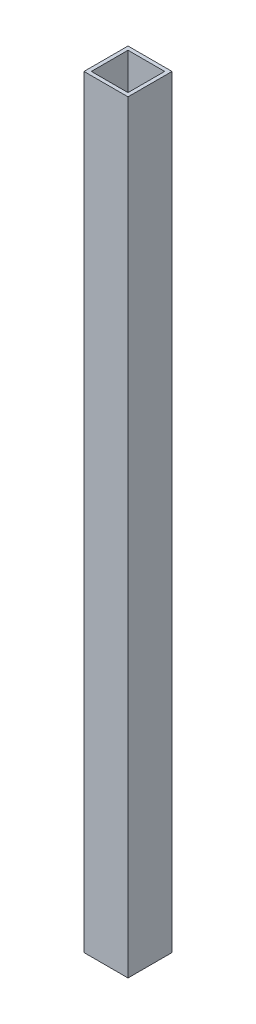
ISO-10303-21;
HEADER;
FILE_DESCRIPTION(('STEP AP214'),'2;1');
FILE_NAME('part.step','',(''),(''),'','','');
FILE_SCHEMA(('AUTOMOTIVE_DESIGN { 1 0 10303 214 1 1 1 1 }'));
ENDSEC;
DATA;
#1=APPLICATION_CONTEXT('core data for automotive mechanical design processes');
#2=APPLICATION_PROTOCOL_DEFINITION('international standard','automotive_design',2000,#1);
#3=PRODUCT_CONTEXT('',#1,'mechanical');
#4=PRODUCT('Part','Part','',(#3));
#5=PRODUCT_RELATED_PRODUCT_CATEGORY('part','',(#4));
#6=PRODUCT_DEFINITION_FORMATION('','',#4);
#7=PRODUCT_DEFINITION_CONTEXT('part definition',#1,'design');
#8=PRODUCT_DEFINITION('design','',#6,#7);
#9=PRODUCT_DEFINITION_SHAPE('','',#8);
#10=(LENGTH_UNIT() NAMED_UNIT(*) SI_UNIT(.MILLI.,.METRE.));
#11=(NAMED_UNIT(*) PLANE_ANGLE_UNIT() SI_UNIT($,.RADIAN.));
#12=(NAMED_UNIT(*) SI_UNIT($,.STERADIAN.) SOLID_ANGLE_UNIT());
#13=UNCERTAINTY_MEASURE_WITH_UNIT(LENGTH_MEASURE(1.E-05),#10,'distance_accuracy_value','');
#14=(GEOMETRIC_REPRESENTATION_CONTEXT(3) GLOBAL_UNCERTAINTY_ASSIGNED_CONTEXT((#13)) GLOBAL_UNIT_ASSIGNED_CONTEXT((#10,
#11,#12)) REPRESENTATION_CONTEXT('',''));
#15=CARTESIAN_POINT('',(0.,0.,0.));
#16=DIRECTION('',(0.,0.,1.));
#17=DIRECTION('',(1.,0.,0.));
#18=AXIS2_PLACEMENT_3D('',#15,#16,#17);
#19=CARTESIAN_POINT('',(0.,330.2,0.));
#20=DIRECTION('',(0.,-1.,0.));
#21=DIRECTION('',(0.,0.,-1.));
#22=AXIS2_PLACEMENT_3D('',#19,#20,#21);
#23=PLANE('',#22);
#24=DIRECTION('',(0.,0.,1.));
#25=VECTOR('',#24,1.);
#26=CARTESIAN_POINT('',(0.,330.2,0.));
#27=LINE('',#26,#25);
#28=CARTESIAN_POINT('',(0.,330.2,-19.05));
#29=VERTEX_POINT('',#28);
#30=CARTESIAN_POINT('',(0.,330.2,0.));
#31=VERTEX_POINT('',#30);
#32=EDGE_CURVE('E134',#29,#31,#27,.T.);
#33=ORIENTED_EDGE('',*,*,#32,.T.);
#34=DIRECTION('',(1.,0.,0.));
#35=VECTOR('',#34,1.);
#36=CARTESIAN_POINT('',(0.,330.2,0.));
#37=LINE('',#36,#35);
#38=CARTESIAN_POINT('',(19.05,330.2,0.));
#39=VERTEX_POINT('',#38);
#40=EDGE_CURVE('E137',#31,#39,#37,.T.);
#41=ORIENTED_EDGE('',*,*,#40,.T.);
#42=DIRECTION('',(0.,0.,-1.));
#43=VECTOR('',#42,1.);
#44=CARTESIAN_POINT('',(19.05,330.2,0.));
#45=LINE('',#44,#43);
#46=CARTESIAN_POINT('',(19.05,330.2,-19.05));
#47=VERTEX_POINT('',#46);
#48=EDGE_CURVE('E140',#39,#47,#45,.T.);
#49=ORIENTED_EDGE('',*,*,#48,.T.);
#50=DIRECTION('',(-1.,0.,0.));
#51=VECTOR('',#50,1.);
#52=CARTESIAN_POINT('',(0.,330.2,-19.05));
#53=LINE('',#52,#51);
#54=EDGE_CURVE('E142',#47,#29,#53,.T.);
#55=ORIENTED_EDGE('',*,*,#54,.T.);
#56=EDGE_LOOP('',(#33,#41,#49,#55));
#57=FACE_BOUND('',#56,.T.);
#58=DIRECTION('',(0.,0.,-1.));
#59=VECTOR('',#58,1.);
#60=CARTESIAN_POINT('',(17.4625,330.2,-1.5875));
#61=LINE('',#60,#59);
#62=CARTESIAN_POINT('',(17.4625,330.2,-1.5875));
#63=VERTEX_POINT('',#62);
#64=CARTESIAN_POINT('',(17.4625,330.2,-17.4625));
#65=VERTEX_POINT('',#64);
#66=EDGE_CURVE('E98',#63,#65,#61,.T.);
#67=ORIENTED_EDGE('',*,*,#66,.F.);
#68=DIRECTION('',(1.,0.,0.));
#69=VECTOR('',#68,1.);
#70=CARTESIAN_POINT('',(1.5875,330.2,-1.5875));
#71=LINE('',#70,#69);
#72=CARTESIAN_POINT('',(1.5875,330.2,-1.5875));
#73=VERTEX_POINT('',#72);
#74=EDGE_CURVE('E120',#73,#63,#71,.T.);
#75=ORIENTED_EDGE('',*,*,#74,.F.);
#76=DIRECTION('',(0.,0.,1.));
#77=VECTOR('',#76,1.);
#78=CARTESIAN_POINT('',(1.5875,330.2,-1.5875));
#79=LINE('',#78,#77);
#80=CARTESIAN_POINT('',(1.5875,330.2,-17.4625));
#81=VERTEX_POINT('',#80);
#82=EDGE_CURVE('E118',#81,#73,#79,.T.);
#83=ORIENTED_EDGE('',*,*,#82,.F.);
#84=DIRECTION('',(-1.,0.,0.));
#85=VECTOR('',#84,1.);
#86=CARTESIAN_POINT('',(1.5875,330.2,-17.4625));
#87=LINE('',#86,#85);
#88=EDGE_CURVE('E106',#65,#81,#87,.T.);
#89=ORIENTED_EDGE('',*,*,#88,.F.);
#90=EDGE_LOOP('',(#67,#75,#83,#89));
#91=FACE_BOUND('',#90,.T.);
#92=ADVANCED_FACE('F33',(#57,#91),#23,.F.);
#93=CARTESIAN_POINT('',(0.,0.,0.));
#94=DIRECTION('',(0.,-1.,0.));
#95=DIRECTION('',(0.,0.,-1.));
#96=AXIS2_PLACEMENT_3D('',#93,#94,#95);
#97=PLANE('',#96);
#98=DIRECTION('',(0.,0.,1.));
#99=VECTOR('',#98,1.);
#100=CARTESIAN_POINT('',(0.,0.,0.));
#101=LINE('',#100,#99);
#102=CARTESIAN_POINT('',(0.,0.,-19.05));
#103=VERTEX_POINT('',#102);
#104=CARTESIAN_POINT('',(0.,0.,0.));
#105=VERTEX_POINT('',#104);
#106=EDGE_CURVE('E114',#103,#105,#101,.T.);
#107=ORIENTED_EDGE('',*,*,#106,.F.);
#108=DIRECTION('',(-1.,0.,0.));
#109=VECTOR('',#108,1.);
#110=CARTESIAN_POINT('',(0.,0.,-19.05));
#111=LINE('',#110,#109);
#112=CARTESIAN_POINT('',(19.05,0.,-19.05));
#113=VERTEX_POINT('',#112);
#114=EDGE_CURVE('E138',#113,#103,#111,.T.);
#115=ORIENTED_EDGE('',*,*,#114,.F.);
#116=DIRECTION('',(0.,0.,-1.));
#117=VECTOR('',#116,1.);
#118=CARTESIAN_POINT('',(19.05,0.,0.));
#119=LINE('',#118,#117);
#120=CARTESIAN_POINT('',(19.05,0.,0.));
#121=VERTEX_POINT('',#120);
#122=EDGE_CURVE('E149',#121,#113,#119,.T.);
#123=ORIENTED_EDGE('',*,*,#122,.F.);
#124=DIRECTION('',(1.,0.,0.));
#125=VECTOR('',#124,1.);
#126=CARTESIAN_POINT('',(0.,0.,0.));
#127=LINE('',#126,#125);
#128=EDGE_CURVE('E147',#105,#121,#127,.T.);
#129=ORIENTED_EDGE('',*,*,#128,.F.);
#130=EDGE_LOOP('',(#107,#115,#123,#129));
#131=FACE_BOUND('',#130,.T.);
#132=DIRECTION('',(1.,0.,0.));
#133=VECTOR('',#132,1.);
#134=CARTESIAN_POINT('',(1.5875,0.,-1.5875));
#135=LINE('',#134,#133);
#136=CARTESIAN_POINT('',(1.5875,0.,-1.5875));
#137=VERTEX_POINT('',#136);
#138=CARTESIAN_POINT('',(17.4625,0.,-1.5875));
#139=VERTEX_POINT('',#138);
#140=EDGE_CURVE('E107',#137,#139,#135,.T.);
#141=ORIENTED_EDGE('',*,*,#140,.T.);
#142=DIRECTION('',(0.,0.,-1.));
#143=VECTOR('',#142,1.);
#144=CARTESIAN_POINT('',(17.4625,0.,-1.5875));
#145=LINE('',#144,#143);
#146=CARTESIAN_POINT('',(17.4625,0.,-17.4625));
#147=VERTEX_POINT('',#146);
#148=EDGE_CURVE('E56',#139,#147,#145,.T.);
#149=ORIENTED_EDGE('',*,*,#148,.T.);
#150=DIRECTION('',(-1.,0.,0.));
#151=VECTOR('',#150,1.);
#152=CARTESIAN_POINT('',(1.5875,0.,-17.4625));
#153=LINE('',#152,#151);
#154=CARTESIAN_POINT('',(1.5875,0.,-17.4625));
#155=VERTEX_POINT('',#154);
#156=EDGE_CURVE('E113',#147,#155,#153,.T.);
#157=ORIENTED_EDGE('',*,*,#156,.T.);
#158=DIRECTION('',(0.,0.,1.));
#159=VECTOR('',#158,1.);
#160=CARTESIAN_POINT('',(1.5875,0.,-1.5875));
#161=LINE('',#160,#159);
#162=EDGE_CURVE('E126',#155,#137,#161,.T.);
#163=ORIENTED_EDGE('',*,*,#162,.T.);
#164=EDGE_LOOP('',(#141,#149,#157,#163));
#165=FACE_BOUND('',#164,.T.);
#166=ADVANCED_FACE('F167',(#131,#165),#97,.T.);
#167=CARTESIAN_POINT('',(0.,330.2,0.));
#168=DIRECTION('',(1.,0.,0.));
#169=DIRECTION('',(0.,0.,-1.));
#170=AXIS2_PLACEMENT_3D('',#167,#168,#169);
#171=PLANE('',#170);
#172=ORIENTED_EDGE('',*,*,#106,.T.);
#173=DIRECTION('',(0.,-1.,0.));
#174=VECTOR('',#173,1.);
#175=CARTESIAN_POINT('',(0.,330.2,0.));
#176=LINE('',#175,#174);
#177=EDGE_CURVE('E11',#31,#105,#176,.T.);
#178=ORIENTED_EDGE('',*,*,#177,.F.);
#179=ORIENTED_EDGE('',*,*,#32,.F.);
#180=DIRECTION('',(0.,-1.,0.));
#181=VECTOR('',#180,1.);
#182=CARTESIAN_POINT('',(0.,330.2,-19.05));
#183=LINE('',#182,#181);
#184=EDGE_CURVE('E144',#29,#103,#183,.T.);
#185=ORIENTED_EDGE('',*,*,#184,.T.);
#186=EDGE_LOOP('',(#172,#178,#179,#185));
#187=FACE_BOUND('',#186,.T.);
#188=ADVANCED_FACE('F35',(#187),#171,.F.);
#189=CARTESIAN_POINT('',(0.,330.2,0.));
#190=DIRECTION('',(0.,0.,-1.));
#191=DIRECTION('',(-1.,0.,0.));
#192=AXIS2_PLACEMENT_3D('',#189,#190,#191);
#193=PLANE('',#192);
#194=ORIENTED_EDGE('',*,*,#128,.T.);
#195=DIRECTION('',(0.,-1.,0.));
#196=VECTOR('',#195,1.);
#197=CARTESIAN_POINT('',(19.05,330.2,0.));
#198=LINE('',#197,#196);
#199=EDGE_CURVE('E41',#39,#121,#198,.T.);
#200=ORIENTED_EDGE('',*,*,#199,.F.);
#201=ORIENTED_EDGE('',*,*,#40,.F.);
#202=ORIENTED_EDGE('',*,*,#177,.T.);
#203=EDGE_LOOP('',(#194,#200,#201,#202));
#204=FACE_BOUND('',#203,.T.);
#205=ADVANCED_FACE('F177',(#204),#193,.F.);
#206=CARTESIAN_POINT('',(19.05,330.2,0.));
#207=DIRECTION('',(-1.,0.,0.));
#208=DIRECTION('',(0.,0.,1.));
#209=AXIS2_PLACEMENT_3D('',#206,#207,#208);
#210=PLANE('',#209);
#211=ORIENTED_EDGE('',*,*,#122,.T.);
#212=DIRECTION('',(0.,-1.,0.));
#213=VECTOR('',#212,1.);
#214=CARTESIAN_POINT('',(19.05,330.2,-19.05));
#215=LINE('',#214,#213);
#216=EDGE_CURVE('E154',#47,#113,#215,.T.);
#217=ORIENTED_EDGE('',*,*,#216,.F.);
#218=ORIENTED_EDGE('',*,*,#48,.F.);
#219=ORIENTED_EDGE('',*,*,#199,.T.);
#220=EDGE_LOOP('',(#211,#217,#218,#219));
#221=FACE_BOUND('',#220,.T.);
#222=ADVANCED_FACE('F161',(#221),#210,.F.);
#223=CARTESIAN_POINT('',(0.,330.2,-19.05));
#224=DIRECTION('',(0.,0.,1.));
#225=DIRECTION('',(1.,0.,0.));
#226=AXIS2_PLACEMENT_3D('',#223,#224,#225);
#227=PLANE('',#226);
#228=ORIENTED_EDGE('',*,*,#114,.T.);
#229=ORIENTED_EDGE('',*,*,#184,.F.);
#230=ORIENTED_EDGE('',*,*,#54,.F.);
#231=ORIENTED_EDGE('',*,*,#216,.T.);
#232=EDGE_LOOP('',(#228,#229,#230,#231));
#233=FACE_BOUND('',#232,.T.);
#234=ADVANCED_FACE('F171',(#233),#227,.F.);
#235=CARTESIAN_POINT('',(17.4625,330.2,-1.5875));
#236=DIRECTION('',(-1.,0.,0.));
#237=DIRECTION('',(0.,0.,1.));
#238=AXIS2_PLACEMENT_3D('',#235,#236,#237);
#239=PLANE('',#238);
#240=ORIENTED_EDGE('',*,*,#148,.F.);
#241=DIRECTION('',(0.,-1.,0.));
#242=VECTOR('',#241,1.);
#243=CARTESIAN_POINT('',(17.4625,330.2,-1.5875));
#244=LINE('',#243,#242);
#245=EDGE_CURVE('E102',#63,#139,#244,.T.);
#246=ORIENTED_EDGE('',*,*,#245,.F.);
#247=ORIENTED_EDGE('',*,*,#66,.T.);
#248=DIRECTION('',(0.,-1.,0.));
#249=VECTOR('',#248,1.);
#250=CARTESIAN_POINT('',(17.4625,330.2,-17.4625));
#251=LINE('',#250,#249);
#252=EDGE_CURVE('E101',#65,#147,#251,.T.);
#253=ORIENTED_EDGE('',*,*,#252,.T.);
#254=EDGE_LOOP('',(#240,#246,#247,#253));
#255=FACE_BOUND('',#254,.T.);
#256=ADVANCED_FACE('F100',(#255),#239,.T.);
#257=CARTESIAN_POINT('',(1.5875,330.2,-17.4625));
#258=DIRECTION('',(0.,0.,1.));
#259=DIRECTION('',(1.,0.,0.));
#260=AXIS2_PLACEMENT_3D('',#257,#258,#259);
#261=PLANE('',#260);
#262=ORIENTED_EDGE('',*,*,#156,.F.);
#263=ORIENTED_EDGE('',*,*,#252,.F.);
#264=ORIENTED_EDGE('',*,*,#88,.T.);
#265=DIRECTION('',(0.,-1.,0.));
#266=VECTOR('',#265,1.);
#267=CARTESIAN_POINT('',(1.5875,330.2,-17.4625));
#268=LINE('',#267,#266);
#269=EDGE_CURVE('E115',#81,#155,#268,.T.);
#270=ORIENTED_EDGE('',*,*,#269,.T.);
#271=EDGE_LOOP('',(#262,#263,#264,#270));
#272=FACE_BOUND('',#271,.T.);
#273=ADVANCED_FACE('F110',(#272),#261,.T.);
#274=CARTESIAN_POINT('',(1.5875,330.2,-1.5875));
#275=DIRECTION('',(1.,0.,0.));
#276=DIRECTION('',(0.,0.,-1.));
#277=AXIS2_PLACEMENT_3D('',#274,#275,#276);
#278=PLANE('',#277);
#279=ORIENTED_EDGE('',*,*,#162,.F.);
#280=ORIENTED_EDGE('',*,*,#269,.F.);
#281=ORIENTED_EDGE('',*,*,#82,.T.);
#282=DIRECTION('',(0.,-1.,0.));
#283=VECTOR('',#282,1.);
#284=CARTESIAN_POINT('',(1.5875,330.2,-1.5875));
#285=LINE('',#284,#283);
#286=EDGE_CURVE('E48',#73,#137,#285,.T.);
#287=ORIENTED_EDGE('',*,*,#286,.T.);
#288=EDGE_LOOP('',(#279,#280,#281,#287));
#289=FACE_BOUND('',#288,.T.);
#290=ADVANCED_FACE('F200',(#289),#278,.T.);
#291=CARTESIAN_POINT('',(1.5875,330.2,-1.5875));
#292=DIRECTION('',(0.,0.,-1.));
#293=DIRECTION('',(-1.,0.,0.));
#294=AXIS2_PLACEMENT_3D('',#291,#292,#293);
#295=PLANE('',#294);
#296=ORIENTED_EDGE('',*,*,#140,.F.);
#297=ORIENTED_EDGE('',*,*,#286,.F.);
#298=ORIENTED_EDGE('',*,*,#74,.T.);
#299=ORIENTED_EDGE('',*,*,#245,.T.);
#300=EDGE_LOOP('',(#296,#297,#298,#299));
#301=FACE_BOUND('',#300,.T.);
#302=ADVANCED_FACE('F204',(#301),#295,.T.);
#303=CLOSED_SHELL('',(#92,#166,#188,#205,#222,#234,#256,#273,#290,#302));
#304=MANIFOLD_SOLID_BREP('B2',#303);
#305=ADVANCED_BREP_SHAPE_REPRESENTATION('',(#18,#304),#14);
#306=SHAPE_DEFINITION_REPRESENTATION(#9,#305);
ENDSEC;
END-ISO-10303-21;
